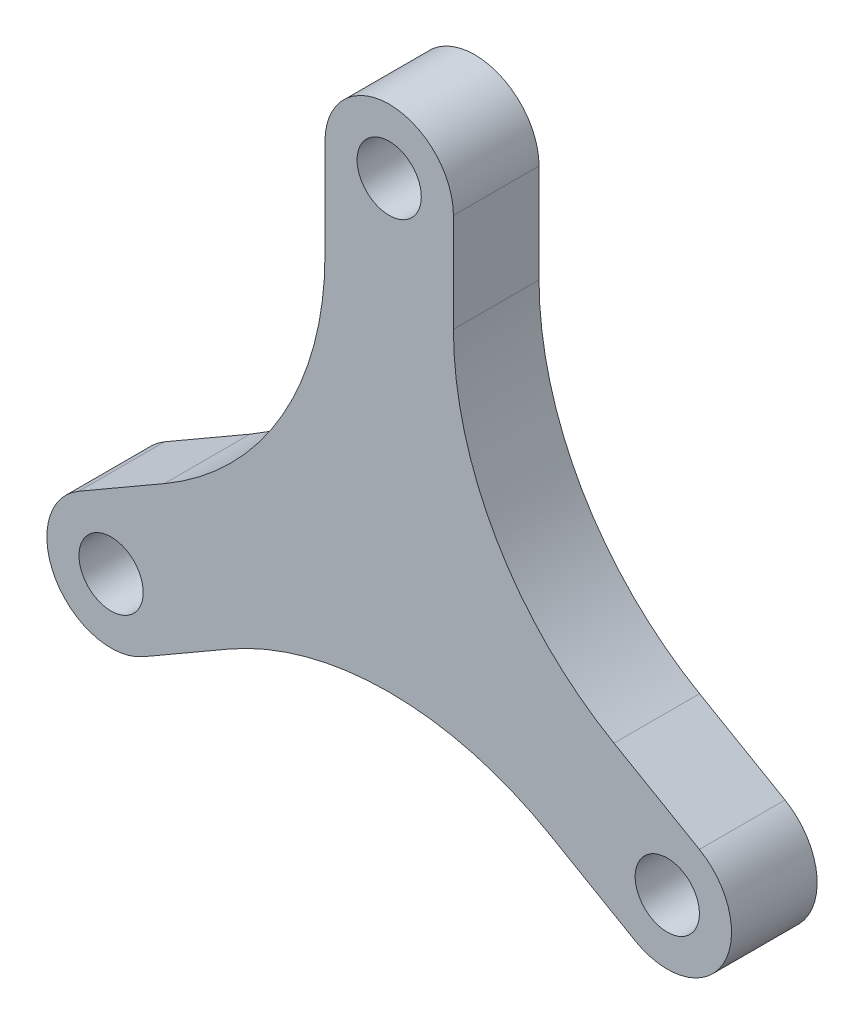
ISO-10303-21;
HEADER;
FILE_DESCRIPTION(('STEP AP214'),'2;1');
FILE_NAME('part.step','',(''),(''),'','','');
FILE_SCHEMA(('AUTOMOTIVE_DESIGN { 1 0 10303 214 1 1 1 1 }'));
ENDSEC;
DATA;
#1=APPLICATION_CONTEXT('core data for automotive mechanical design processes');
#2=APPLICATION_PROTOCOL_DEFINITION('international standard','automotive_design',2000,#1);
#3=PRODUCT_CONTEXT('',#1,'mechanical');
#4=PRODUCT('Part','Part','',(#3));
#5=PRODUCT_RELATED_PRODUCT_CATEGORY('part','',(#4));
#6=PRODUCT_DEFINITION_FORMATION('','',#4);
#7=PRODUCT_DEFINITION_CONTEXT('part definition',#1,'design');
#8=PRODUCT_DEFINITION('design','',#6,#7);
#9=PRODUCT_DEFINITION_SHAPE('','',#8);
#10=(LENGTH_UNIT() NAMED_UNIT(*) SI_UNIT(.MILLI.,.METRE.));
#11=(NAMED_UNIT(*) PLANE_ANGLE_UNIT() SI_UNIT($,.RADIAN.));
#12=(NAMED_UNIT(*) SI_UNIT($,.STERADIAN.) SOLID_ANGLE_UNIT());
#13=UNCERTAINTY_MEASURE_WITH_UNIT(LENGTH_MEASURE(1.E-05),#10,'distance_accuracy_value','');
#14=(GEOMETRIC_REPRESENTATION_CONTEXT(3) GLOBAL_UNCERTAINTY_ASSIGNED_CONTEXT((#13)) GLOBAL_UNIT_ASSIGNED_CONTEXT((#10,
#11,#12)) REPRESENTATION_CONTEXT('',''));
#15=CARTESIAN_POINT('',(0.,0.,0.));
#16=DIRECTION('',(0.,0.,1.));
#17=DIRECTION('',(1.,0.,0.));
#18=AXIS2_PLACEMENT_3D('',#15,#16,#17);
#19=CARTESIAN_POINT('',(0.,15.,4.));
#20=DIRECTION('',(0.,0.,1.));
#21=DIRECTION('',(1.,0.,0.));
#22=AXIS2_PLACEMENT_3D('',#19,#20,#21);
#23=PLANE('',#22);
#24=CARTESIAN_POINT('',(12.9903810567665,-7.49999999999926,4.));
#25=DIRECTION('',(0.,0.,1.));
#26=DIRECTION('',(1.,0.,0.));
#27=AXIS2_PLACEMENT_3D('',#24,#25,#26);
#28=CIRCLE('',#27,1.50000000000078);
#29=CARTESIAN_POINT('',(14.4903810567673,-7.49999999999926,4.));
#30=VERTEX_POINT('',#29);
#31=EDGE_CURVE('E360',#30,#30,#28,.T.);
#32=ORIENTED_EDGE('',*,*,#31,.F.);
#33=EDGE_LOOP('',(#32));
#34=FACE_BOUND('',#33,.T.);
#35=DIRECTION('',(0.,-1.,0.));
#36=VECTOR('',#35,1.);
#37=CARTESIAN_POINT('',(-3.,15.,4.));
#38=LINE('',#37,#36);
#39=CARTESIAN_POINT('',(-3.,15.,4.));
#40=VERTEX_POINT('',#39);
#41=CARTESIAN_POINT('',(-3.,10.3923048454133,4.));
#42=VERTEX_POINT('',#41);
#43=EDGE_CURVE('E379',#40,#42,#38,.T.);
#44=ORIENTED_EDGE('',*,*,#43,.T.);
#45=CARTESIAN_POINT('',(-18.,10.3923048454133,4.));
#46=DIRECTION('',(0.,0.,1.));
#47=DIRECTION('',(1.,0.,0.));
#48=AXIS2_PLACEMENT_3D('',#45,#46,#47);
#49=CIRCLE('',#48,15.);
#50=CARTESIAN_POINT('',(-10.5,-2.59807621135326,4.));
#51=VERTEX_POINT('',#50);
#52=EDGE_CURVE('E137',#42,#51,#49,.F.);
#53=ORIENTED_EDGE('',*,*,#52,.T.);
#54=DIRECTION('',(-0.866025403784438,-0.5,0.));
#55=VECTOR('',#54,1.);
#56=CARTESIAN_POINT('',(-14.490381056766,-4.90192378864628,4.));
#57=LINE('',#56,#55);
#58=CARTESIAN_POINT('',(-14.490381056766,-4.90192378864628,4.));
#59=VERTEX_POINT('',#58);
#60=EDGE_CURVE('E129',#51,#59,#57,.T.);
#61=ORIENTED_EDGE('',*,*,#60,.T.);
#62=CARTESIAN_POINT('',(-12.990381056766,-7.4999999999996,4.));
#63=DIRECTION('',(0.,0.,1.));
#64=DIRECTION('',(1.,0.,0.));
#65=AXIS2_PLACEMENT_3D('',#62,#63,#64);
#66=CIRCLE('',#65,3.);
#67=CARTESIAN_POINT('',(-11.490381056766,-10.0980762113529,4.));
#68=VERTEX_POINT('',#67);
#69=EDGE_CURVE('E134',#59,#68,#66,.T.);
#70=ORIENTED_EDGE('',*,*,#69,.T.);
#71=DIRECTION('',(0.866025403784438,0.5,0.));
#72=VECTOR('',#71,1.);
#73=CARTESIAN_POINT('',(-11.490381056766,-10.0980762113529,4.));
#74=LINE('',#73,#72);
#75=CARTESIAN_POINT('',(-7.49999999999943,-7.79422863405957,4.));
#76=VERTEX_POINT('',#75);
#77=EDGE_CURVE('E151',#68,#76,#74,.T.);
#78=ORIENTED_EDGE('',*,*,#77,.T.);
#79=CARTESIAN_POINT('',(5.79397640976254E-13,-20.7846096908261,4.));
#80=DIRECTION('',(0.,0.,1.));
#81=DIRECTION('',(1.,0.,0.));
#82=AXIS2_PLACEMENT_3D('',#79,#80,#81);
#83=CIRCLE('',#82,15.);
#84=CARTESIAN_POINT('',(7.50000000000058,-7.79422863405957,4.));
#85=VERTEX_POINT('',#84);
#86=EDGE_CURVE('E177',#76,#85,#83,.F.);
#87=ORIENTED_EDGE('',*,*,#86,.T.);
#88=DIRECTION('',(0.866025403784439,-0.5,0.));
#89=VECTOR('',#88,1.);
#90=CARTESIAN_POINT('',(11.4903810567665,-10.0980762113526,4.));
#91=LINE('',#90,#89);
#92=CARTESIAN_POINT('',(11.4903810567665,-10.0980762113526,4.));
#93=VERTEX_POINT('',#92);
#94=EDGE_CURVE('E369',#85,#93,#91,.T.);
#95=ORIENTED_EDGE('',*,*,#94,.T.);
#96=CARTESIAN_POINT('',(12.9903810567665,-7.49999999999926,4.));
#97=DIRECTION('',(0.,0.,1.));
#98=DIRECTION('',(1.,0.,0.));
#99=AXIS2_PLACEMENT_3D('',#96,#97,#98);
#100=CIRCLE('',#99,3.);
#101=CARTESIAN_POINT('',(14.4903810567665,-4.90192378864594,4.));
#102=VERTEX_POINT('',#101);
#103=EDGE_CURVE('E371',#93,#102,#100,.T.);
#104=ORIENTED_EDGE('',*,*,#103,.T.);
#105=DIRECTION('',(-0.866025403784439,0.5,0.));
#106=VECTOR('',#105,1.);
#107=CARTESIAN_POINT('',(14.4903810567665,-4.90192378864594,4.));
#108=LINE('',#107,#106);
#109=CARTESIAN_POINT('',(10.5,-2.5980762113526,4.));
#110=VERTEX_POINT('',#109);
#111=EDGE_CURVE('E373',#102,#110,#108,.T.);
#112=ORIENTED_EDGE('',*,*,#111,.T.);
#113=CARTESIAN_POINT('',(18.,10.392304845414,4.));
#114=DIRECTION('',(0.,0.,1.));
#115=DIRECTION('',(1.,0.,0.));
#116=AXIS2_PLACEMENT_3D('',#113,#114,#115);
#117=CIRCLE('',#116,15.);
#118=CARTESIAN_POINT('',(3.,10.392304845414,4.));
#119=VERTEX_POINT('',#118);
#120=EDGE_CURVE('E11',#110,#119,#117,.F.);
#121=ORIENTED_EDGE('',*,*,#120,.T.);
#122=DIRECTION('',(0.,1.,0.));
#123=VECTOR('',#122,1.);
#124=CARTESIAN_POINT('',(3.,15.,4.));
#125=LINE('',#124,#123);
#126=CARTESIAN_POINT('',(3.,15.,4.));
#127=VERTEX_POINT('',#126);
#128=EDGE_CURVE('E375',#119,#127,#125,.T.);
#129=ORIENTED_EDGE('',*,*,#128,.T.);
#130=CARTESIAN_POINT('',(0.,15.,4.));
#131=DIRECTION('',(0.,0.,1.));
#132=DIRECTION('',(1.,0.,0.));
#133=AXIS2_PLACEMENT_3D('',#130,#131,#132);
#134=CIRCLE('',#133,3.);
#135=EDGE_CURVE('E377',#127,#40,#134,.T.);
#136=ORIENTED_EDGE('',*,*,#135,.T.);
#137=EDGE_LOOP('',(#44,#53,#61,#70,#78,#87,#95,#104,#112,#121,#129,#136));
#138=FACE_BOUND('',#137,.T.);
#139=CARTESIAN_POINT('',(0.,15.,4.));
#140=DIRECTION('',(0.,0.,1.));
#141=DIRECTION('',(1.,0.,0.));
#142=AXIS2_PLACEMENT_3D('',#139,#140,#141);
#143=CIRCLE('',#142,1.5);
#144=CARTESIAN_POINT('',(1.5,15.,4.));
#145=VERTEX_POINT('',#144);
#146=EDGE_CURVE('E356',#145,#145,#143,.T.);
#147=ORIENTED_EDGE('',*,*,#146,.F.);
#148=EDGE_LOOP('',(#147));
#149=FACE_BOUND('',#148,.T.);
#150=CARTESIAN_POINT('',(-12.990381056766,-7.4999999999996,4.));
#151=DIRECTION('',(0.,0.,1.));
#152=DIRECTION('',(1.,0.,0.));
#153=AXIS2_PLACEMENT_3D('',#150,#151,#152);
#154=CIRCLE('',#153,1.50000000000031);
#155=CARTESIAN_POINT('',(-11.4903810567656,-7.4999999999996,4.));
#156=VERTEX_POINT('',#155);
#157=EDGE_CURVE('E419',#156,#156,#154,.T.);
#158=ORIENTED_EDGE('',*,*,#157,.F.);
#159=EDGE_LOOP('',(#158));
#160=FACE_BOUND('',#159,.T.);
#161=ADVANCED_FACE('F41',(#34,#138,#149,#160),#23,.T.);
#162=CARTESIAN_POINT('',(0.,15.,0.));
#163=DIRECTION('',(0.,0.,1.));
#164=DIRECTION('',(1.,0.,0.));
#165=AXIS2_PLACEMENT_3D('',#162,#163,#164);
#166=PLANE('',#165);
#167=DIRECTION('',(-0.866025403784438,-0.5,0.));
#168=VECTOR('',#167,1.);
#169=CARTESIAN_POINT('',(-14.490381056766,-4.90192378864628,0.));
#170=LINE('',#169,#168);
#171=CARTESIAN_POINT('',(-10.5,-2.59807621135326,0.));
#172=VERTEX_POINT('',#171);
#173=CARTESIAN_POINT('',(-14.490381056766,-4.90192378864628,0.));
#174=VERTEX_POINT('',#173);
#175=EDGE_CURVE('E155',#172,#174,#170,.T.);
#176=ORIENTED_EDGE('',*,*,#175,.F.);
#177=CARTESIAN_POINT('',(-18.,10.3923048454133,0.));
#178=DIRECTION('',(0.,0.,1.));
#179=DIRECTION('',(1.,0.,0.));
#180=AXIS2_PLACEMENT_3D('',#177,#178,#179);
#181=CIRCLE('',#180,15.);
#182=CARTESIAN_POINT('',(-3.,10.3923048454133,0.));
#183=VERTEX_POINT('',#182);
#184=EDGE_CURVE('E179',#172,#183,#181,.T.);
#185=ORIENTED_EDGE('',*,*,#184,.T.);
#186=DIRECTION('',(0.,-1.,0.));
#187=VECTOR('',#186,1.);
#188=CARTESIAN_POINT('',(-3.,15.,0.));
#189=LINE('',#188,#187);
#190=CARTESIAN_POINT('',(-3.,15.,0.));
#191=VERTEX_POINT('',#190);
#192=EDGE_CURVE('E142',#191,#183,#189,.T.);
#193=ORIENTED_EDGE('',*,*,#192,.F.);
#194=CARTESIAN_POINT('',(0.,15.,0.));
#195=DIRECTION('',(0.,0.,1.));
#196=DIRECTION('',(1.,0.,0.));
#197=AXIS2_PLACEMENT_3D('',#194,#195,#196);
#198=CIRCLE('',#197,3.);
#199=CARTESIAN_POINT('',(3.,15.,0.));
#200=VERTEX_POINT('',#199);
#201=EDGE_CURVE('E194',#200,#191,#198,.T.);
#202=ORIENTED_EDGE('',*,*,#201,.F.);
#203=DIRECTION('',(0.,1.,0.));
#204=VECTOR('',#203,1.);
#205=CARTESIAN_POINT('',(3.,15.,0.));
#206=LINE('',#205,#204);
#207=CARTESIAN_POINT('',(3.,10.392304845414,0.));
#208=VERTEX_POINT('',#207);
#209=EDGE_CURVE('E393',#208,#200,#206,.T.);
#210=ORIENTED_EDGE('',*,*,#209,.F.);
#211=CARTESIAN_POINT('',(18.,10.392304845414,0.));
#212=DIRECTION('',(0.,0.,1.));
#213=DIRECTION('',(1.,0.,0.));
#214=AXIS2_PLACEMENT_3D('',#211,#212,#213);
#215=CIRCLE('',#214,15.);
#216=CARTESIAN_POINT('',(10.5,-2.5980762113526,0.));
#217=VERTEX_POINT('',#216);
#218=EDGE_CURVE('E49',#208,#217,#215,.T.);
#219=ORIENTED_EDGE('',*,*,#218,.T.);
#220=DIRECTION('',(-0.866025403784439,0.5,0.));
#221=VECTOR('',#220,1.);
#222=CARTESIAN_POINT('',(14.4903810567665,-4.90192378864594,0.));
#223=LINE('',#222,#221);
#224=CARTESIAN_POINT('',(14.4903810567665,-4.90192378864594,0.));
#225=VERTEX_POINT('',#224);
#226=EDGE_CURVE('E391',#225,#217,#223,.T.);
#227=ORIENTED_EDGE('',*,*,#226,.F.);
#228=CARTESIAN_POINT('',(12.9903810567665,-7.49999999999926,0.));
#229=DIRECTION('',(0.,0.,1.));
#230=DIRECTION('',(1.,0.,0.));
#231=AXIS2_PLACEMENT_3D('',#228,#229,#230);
#232=CIRCLE('',#231,3.);
#233=CARTESIAN_POINT('',(11.4903810567665,-10.0980762113526,0.));
#234=VERTEX_POINT('',#233);
#235=EDGE_CURVE('E389',#234,#225,#232,.T.);
#236=ORIENTED_EDGE('',*,*,#235,.F.);
#237=DIRECTION('',(0.866025403784439,-0.5,0.));
#238=VECTOR('',#237,1.);
#239=CARTESIAN_POINT('',(11.4903810567665,-10.0980762113526,0.));
#240=LINE('',#239,#238);
#241=CARTESIAN_POINT('',(7.50000000000058,-7.79422863405957,0.));
#242=VERTEX_POINT('',#241);
#243=EDGE_CURVE('E387',#242,#234,#240,.T.);
#244=ORIENTED_EDGE('',*,*,#243,.F.);
#245=CARTESIAN_POINT('',(5.79397640976254E-13,-20.7846096908261,0.));
#246=DIRECTION('',(0.,0.,1.));
#247=DIRECTION('',(1.,0.,0.));
#248=AXIS2_PLACEMENT_3D('',#245,#246,#247);
#249=CIRCLE('',#248,15.);
#250=CARTESIAN_POINT('',(-7.49999999999943,-7.79422863405957,0.));
#251=VERTEX_POINT('',#250);
#252=EDGE_CURVE('E175',#242,#251,#249,.T.);
#253=ORIENTED_EDGE('',*,*,#252,.T.);
#254=DIRECTION('',(0.866025403784438,0.5,0.));
#255=VECTOR('',#254,1.);
#256=CARTESIAN_POINT('',(-11.490381056766,-10.0980762113529,0.));
#257=LINE('',#256,#255);
#258=CARTESIAN_POINT('',(-11.490381056766,-10.0980762113529,0.));
#259=VERTEX_POINT('',#258);
#260=EDGE_CURVE('E384',#259,#251,#257,.T.);
#261=ORIENTED_EDGE('',*,*,#260,.F.);
#262=CARTESIAN_POINT('',(-12.990381056766,-7.4999999999996,0.));
#263=DIRECTION('',(0.,0.,1.));
#264=DIRECTION('',(1.,0.,0.));
#265=AXIS2_PLACEMENT_3D('',#262,#263,#264);
#266=CIRCLE('',#265,3.);
#267=EDGE_CURVE('E382',#174,#259,#266,.T.);
#268=ORIENTED_EDGE('',*,*,#267,.F.);
#269=EDGE_LOOP('',(#176,#185,#193,#202,#210,#219,#227,#236,#244,#253,#261,#268));
#270=FACE_BOUND('',#269,.T.);
#271=CARTESIAN_POINT('',(0.,15.,0.));
#272=DIRECTION('',(0.,0.,1.));
#273=DIRECTION('',(1.,0.,0.));
#274=AXIS2_PLACEMENT_3D('',#271,#272,#273);
#275=CIRCLE('',#274,1.5);
#276=CARTESIAN_POINT('',(1.5,15.,0.));
#277=VERTEX_POINT('',#276);
#278=EDGE_CURVE('E359',#277,#277,#275,.T.);
#279=ORIENTED_EDGE('',*,*,#278,.T.);
#280=EDGE_LOOP('',(#279));
#281=FACE_BOUND('',#280,.T.);
#282=CARTESIAN_POINT('',(12.9903810567665,-7.49999999999926,0.));
#283=DIRECTION('',(0.,0.,1.));
#284=DIRECTION('',(1.,0.,0.));
#285=AXIS2_PLACEMENT_3D('',#282,#283,#284);
#286=CIRCLE('',#285,1.50000000000078);
#287=CARTESIAN_POINT('',(14.4903810567673,-7.49999999999926,0.));
#288=VERTEX_POINT('',#287);
#289=EDGE_CURVE('E364',#288,#288,#286,.T.);
#290=ORIENTED_EDGE('',*,*,#289,.T.);
#291=EDGE_LOOP('',(#290));
#292=FACE_BOUND('',#291,.T.);
#293=CARTESIAN_POINT('',(-12.990381056766,-7.4999999999996,0.));
#294=DIRECTION('',(0.,0.,1.));
#295=DIRECTION('',(1.,0.,0.));
#296=AXIS2_PLACEMENT_3D('',#293,#294,#295);
#297=CIRCLE('',#296,1.50000000000031);
#298=CARTESIAN_POINT('',(-11.4903810567656,-7.4999999999996,0.));
#299=VERTEX_POINT('',#298);
#300=EDGE_CURVE('E421',#299,#299,#297,.T.);
#301=ORIENTED_EDGE('',*,*,#300,.T.);
#302=EDGE_LOOP('',(#301));
#303=FACE_BOUND('',#302,.T.);
#304=ADVANCED_FACE('F183',(#270,#281,#292,#303),#166,.F.);
#305=CARTESIAN_POINT('',(-14.490381056766,-4.90192378864628,4.));
#306=DIRECTION('',(0.5,-0.866025403784438,0.));
#307=DIRECTION('',(0.866025403784438,0.5,0.));
#308=AXIS2_PLACEMENT_3D('',#305,#306,#307);
#309=PLANE('',#308);
#310=ORIENTED_EDGE('',*,*,#60,.F.);
#311=DIRECTION('',(0.,0.,-1.));
#312=VECTOR('',#311,1.);
#313=CARTESIAN_POINT('',(-10.5,-2.59807621135326,0.));
#314=LINE('',#313,#312);
#315=EDGE_CURVE('E167',#51,#172,#314,.T.);
#316=ORIENTED_EDGE('',*,*,#315,.T.);
#317=ORIENTED_EDGE('',*,*,#175,.T.);
#318=DIRECTION('',(0.,0.,-1.));
#319=VECTOR('',#318,1.);
#320=CARTESIAN_POINT('',(-14.490381056766,-4.90192378864628,4.));
#321=LINE('',#320,#319);
#322=EDGE_CURVE('E147',#59,#174,#321,.T.);
#323=ORIENTED_EDGE('',*,*,#322,.F.);
#324=EDGE_LOOP('',(#310,#316,#317,#323));
#325=FACE_BOUND('',#324,.T.);
#326=ADVANCED_FACE('F153',(#325),#309,.F.);
#327=CARTESIAN_POINT('',(-12.990381056766,-7.4999999999996,4.));
#328=DIRECTION('',(0.,0.,-1.));
#329=DIRECTION('',(-1.,0.,0.));
#330=AXIS2_PLACEMENT_3D('',#327,#328,#329);
#331=CYLINDRICAL_SURFACE('',#330,3.);
#332=ORIENTED_EDGE('',*,*,#267,.T.);
#333=DIRECTION('',(0.,0.,-1.));
#334=VECTOR('',#333,1.);
#335=CARTESIAN_POINT('',(-11.490381056766,-10.0980762113529,4.));
#336=LINE('',#335,#334);
#337=EDGE_CURVE('E149',#68,#259,#336,.T.);
#338=ORIENTED_EDGE('',*,*,#337,.F.);
#339=ORIENTED_EDGE('',*,*,#69,.F.);
#340=ORIENTED_EDGE('',*,*,#322,.T.);
#341=EDGE_LOOP('',(#332,#338,#339,#340));
#342=FACE_BOUND('',#341,.T.);
#343=ADVANCED_FACE('F146',(#342),#331,.T.);
#344=CARTESIAN_POINT('',(-11.490381056766,-10.0980762113529,4.));
#345=DIRECTION('',(-0.5,0.866025403784438,0.));
#346=DIRECTION('',(-0.866025403784438,-0.5,0.));
#347=AXIS2_PLACEMENT_3D('',#344,#345,#346);
#348=PLANE('',#347);
#349=ORIENTED_EDGE('',*,*,#260,.T.);
#350=DIRECTION('',(0.,0.,-1.));
#351=VECTOR('',#350,1.);
#352=CARTESIAN_POINT('',(-7.49999999999943,-7.79422863405957,4.));
#353=LINE('',#352,#351);
#354=EDGE_CURVE('E160',#251,#76,#353,.F.);
#355=ORIENTED_EDGE('',*,*,#354,.T.);
#356=ORIENTED_EDGE('',*,*,#77,.F.);
#357=ORIENTED_EDGE('',*,*,#337,.T.);
#358=EDGE_LOOP('',(#349,#355,#356,#357));
#359=FACE_BOUND('',#358,.T.);
#360=ADVANCED_FACE('F240',(#359),#348,.F.);
#361=CARTESIAN_POINT('',(11.4903810567665,-10.0980762113526,4.));
#362=DIRECTION('',(0.5,0.866025403784439,0.));
#363=DIRECTION('',(-0.866025403784439,0.5,0.));
#364=AXIS2_PLACEMENT_3D('',#361,#362,#363);
#365=PLANE('',#364);
#366=ORIENTED_EDGE('',*,*,#94,.F.);
#367=DIRECTION('',(0.,0.,-1.));
#368=VECTOR('',#367,1.);
#369=CARTESIAN_POINT('',(7.50000000000058,-7.79422863405957,0.));
#370=LINE('',#369,#368);
#371=EDGE_CURVE('E157',#85,#242,#370,.T.);
#372=ORIENTED_EDGE('',*,*,#371,.T.);
#373=ORIENTED_EDGE('',*,*,#243,.T.);
#374=DIRECTION('',(0.,0.,-1.));
#375=VECTOR('',#374,1.);
#376=CARTESIAN_POINT('',(11.4903810567665,-10.0980762113526,4.));
#377=LINE('',#376,#375);
#378=EDGE_CURVE('E162',#93,#234,#377,.T.);
#379=ORIENTED_EDGE('',*,*,#378,.F.);
#380=EDGE_LOOP('',(#366,#372,#373,#379));
#381=FACE_BOUND('',#380,.T.);
#382=ADVANCED_FACE('F236',(#381),#365,.F.);
#383=CARTESIAN_POINT('',(12.9903810567665,-7.49999999999926,4.));
#384=DIRECTION('',(0.,0.,-1.));
#385=DIRECTION('',(-1.,0.,0.));
#386=AXIS2_PLACEMENT_3D('',#383,#384,#385);
#387=CYLINDRICAL_SURFACE('',#386,3.);
#388=ORIENTED_EDGE('',*,*,#235,.T.);
#389=DIRECTION('',(0.,0.,-1.));
#390=VECTOR('',#389,1.);
#391=CARTESIAN_POINT('',(14.4903810567665,-4.90192378864594,4.));
#392=LINE('',#391,#390);
#393=EDGE_CURVE('E400',#102,#225,#392,.T.);
#394=ORIENTED_EDGE('',*,*,#393,.F.);
#395=ORIENTED_EDGE('',*,*,#103,.F.);
#396=ORIENTED_EDGE('',*,*,#378,.T.);
#397=EDGE_LOOP('',(#388,#394,#395,#396));
#398=FACE_BOUND('',#397,.T.);
#399=ADVANCED_FACE('F233',(#398),#387,.T.);
#400=CARTESIAN_POINT('',(14.4903810567665,-4.90192378864594,4.));
#401=DIRECTION('',(-0.5,-0.866025403784439,0.));
#402=DIRECTION('',(0.866025403784439,-0.5,0.));
#403=AXIS2_PLACEMENT_3D('',#400,#401,#402);
#404=PLANE('',#403);
#405=ORIENTED_EDGE('',*,*,#226,.T.);
#406=DIRECTION('',(0.,0.,-1.));
#407=VECTOR('',#406,1.);
#408=CARTESIAN_POINT('',(10.5,-2.5980762113526,4.));
#409=LINE('',#408,#407);
#410=EDGE_CURVE('E56',#217,#110,#409,.F.);
#411=ORIENTED_EDGE('',*,*,#410,.T.);
#412=ORIENTED_EDGE('',*,*,#111,.F.);
#413=ORIENTED_EDGE('',*,*,#393,.T.);
#414=EDGE_LOOP('',(#405,#411,#412,#413));
#415=FACE_BOUND('',#414,.T.);
#416=ADVANCED_FACE('F229',(#415),#404,.F.);
#417=CARTESIAN_POINT('',(3.,15.,4.));
#418=DIRECTION('',(-1.,0.,0.));
#419=DIRECTION('',(0.,-1.,0.));
#420=AXIS2_PLACEMENT_3D('',#417,#418,#419);
#421=PLANE('',#420);
#422=ORIENTED_EDGE('',*,*,#128,.F.);
#423=DIRECTION('',(0.,0.,-1.));
#424=VECTOR('',#423,1.);
#425=CARTESIAN_POINT('',(3.,10.392304845414,0.));
#426=LINE('',#425,#424);
#427=EDGE_CURVE('E171',#119,#208,#426,.T.);
#428=ORIENTED_EDGE('',*,*,#427,.T.);
#429=ORIENTED_EDGE('',*,*,#209,.T.);
#430=DIRECTION('',(0.,0.,-1.));
#431=VECTOR('',#430,1.);
#432=CARTESIAN_POINT('',(3.,15.,4.));
#433=LINE('',#432,#431);
#434=EDGE_CURVE('E397',#127,#200,#433,.T.);
#435=ORIENTED_EDGE('',*,*,#434,.F.);
#436=EDGE_LOOP('',(#422,#428,#429,#435));
#437=FACE_BOUND('',#436,.T.);
#438=ADVANCED_FACE('F225',(#437),#421,.F.);
#439=CARTESIAN_POINT('',(0.,15.,4.));
#440=DIRECTION('',(0.,0.,-1.));
#441=DIRECTION('',(-1.,0.,0.));
#442=AXIS2_PLACEMENT_3D('',#439,#440,#441);
#443=CYLINDRICAL_SURFACE('',#442,3.);
#444=ORIENTED_EDGE('',*,*,#201,.T.);
#445=DIRECTION('',(0.,0.,-1.));
#446=VECTOR('',#445,1.);
#447=CARTESIAN_POINT('',(-3.,15.,4.));
#448=LINE('',#447,#446);
#449=EDGE_CURVE('E193',#40,#191,#448,.T.);
#450=ORIENTED_EDGE('',*,*,#449,.F.);
#451=ORIENTED_EDGE('',*,*,#135,.F.);
#452=ORIENTED_EDGE('',*,*,#434,.T.);
#453=EDGE_LOOP('',(#444,#450,#451,#452));
#454=FACE_BOUND('',#453,.T.);
#455=ADVANCED_FACE('F222',(#454),#443,.T.);
#456=CARTESIAN_POINT('',(-3.,15.,4.));
#457=DIRECTION('',(1.,0.,0.));
#458=DIRECTION('',(0.,1.,0.));
#459=AXIS2_PLACEMENT_3D('',#456,#457,#458);
#460=PLANE('',#459);
#461=ORIENTED_EDGE('',*,*,#192,.T.);
#462=DIRECTION('',(0.,0.,-1.));
#463=VECTOR('',#462,1.);
#464=CARTESIAN_POINT('',(-3.,10.3923048454133,4.));
#465=LINE('',#464,#463);
#466=EDGE_CURVE('E169',#183,#42,#465,.F.);
#467=ORIENTED_EDGE('',*,*,#466,.T.);
#468=ORIENTED_EDGE('',*,*,#43,.F.);
#469=ORIENTED_EDGE('',*,*,#449,.T.);
#470=EDGE_LOOP('',(#461,#467,#468,#469));
#471=FACE_BOUND('',#470,.T.);
#472=ADVANCED_FACE('F190',(#471),#460,.F.);
#473=CARTESIAN_POINT('',(0.,15.,4.));
#474=DIRECTION('',(0.,0.,-1.));
#475=DIRECTION('',(-1.,0.,0.));
#476=AXIS2_PLACEMENT_3D('',#473,#474,#475);
#477=CYLINDRICAL_SURFACE('',#476,1.5);
#478=ORIENTED_EDGE('',*,*,#146,.T.);
#479=EDGE_LOOP('',(#478));
#480=FACE_BOUND('',#479,.T.);
#481=ORIENTED_EDGE('',*,*,#278,.F.);
#482=EDGE_LOOP('',(#481));
#483=FACE_BOUND('',#482,.T.);
#484=ADVANCED_FACE('F217',(#480,#483),#477,.F.);
#485=CARTESIAN_POINT('',(12.9903810567665,-7.49999999999926,4.));
#486=DIRECTION('',(0.,0.,-1.));
#487=DIRECTION('',(-1.,0.,0.));
#488=AXIS2_PLACEMENT_3D('',#485,#486,#487);
#489=CYLINDRICAL_SURFACE('',#488,1.50000000000078);
#490=ORIENTED_EDGE('',*,*,#31,.T.);
#491=EDGE_LOOP('',(#490));
#492=FACE_BOUND('',#491,.T.);
#493=ORIENTED_EDGE('',*,*,#289,.F.);
#494=EDGE_LOOP('',(#493));
#495=FACE_BOUND('',#494,.T.);
#496=ADVANCED_FACE('F305',(#492,#495),#489,.F.);
#497=CARTESIAN_POINT('',(-12.990381056766,-7.4999999999996,4.));
#498=DIRECTION('',(0.,0.,-1.));
#499=DIRECTION('',(-1.,0.,0.));
#500=AXIS2_PLACEMENT_3D('',#497,#498,#499);
#501=CYLINDRICAL_SURFACE('',#500,1.50000000000031);
#502=ORIENTED_EDGE('',*,*,#157,.T.);
#503=EDGE_LOOP('',(#502));
#504=FACE_BOUND('',#503,.T.);
#505=ORIENTED_EDGE('',*,*,#300,.F.);
#506=EDGE_LOOP('',(#505));
#507=FACE_BOUND('',#506,.T.);
#508=ADVANCED_FACE('F204',(#504,#507),#501,.F.);
#509=CARTESIAN_POINT('',(5.79397640976254E-13,-20.7846096908261,4.));
#510=DIRECTION('',(0.,0.,1.));
#511=DIRECTION('',(1.,0.,0.));
#512=AXIS2_PLACEMENT_3D('',#509,#510,#511);
#513=CYLINDRICAL_SURFACE('',#512,15.);
#514=ORIENTED_EDGE('',*,*,#86,.F.);
#515=ORIENTED_EDGE('',*,*,#354,.F.);
#516=ORIENTED_EDGE('',*,*,#252,.F.);
#517=ORIENTED_EDGE('',*,*,#371,.F.);
#518=EDGE_LOOP('',(#514,#515,#516,#517));
#519=FACE_BOUND('',#518,.T.);
#520=ADVANCED_FACE('F198',(#519),#513,.F.);
#521=CARTESIAN_POINT('',(-18.,10.3923048454133,4.));
#522=DIRECTION('',(0.,0.,1.));
#523=DIRECTION('',(1.,0.,0.));
#524=AXIS2_PLACEMENT_3D('',#521,#522,#523);
#525=CYLINDRICAL_SURFACE('',#524,15.);
#526=ORIENTED_EDGE('',*,*,#52,.F.);
#527=ORIENTED_EDGE('',*,*,#466,.F.);
#528=ORIENTED_EDGE('',*,*,#184,.F.);
#529=ORIENTED_EDGE('',*,*,#315,.F.);
#530=EDGE_LOOP('',(#526,#527,#528,#529));
#531=FACE_BOUND('',#530,.T.);
#532=ADVANCED_FACE('F196',(#531),#525,.F.);
#533=CARTESIAN_POINT('',(18.,10.392304845414,4.));
#534=DIRECTION('',(0.,0.,1.));
#535=DIRECTION('',(1.,0.,0.));
#536=AXIS2_PLACEMENT_3D('',#533,#534,#535);
#537=CYLINDRICAL_SURFACE('',#536,15.);
#538=ORIENTED_EDGE('',*,*,#120,.F.);
#539=ORIENTED_EDGE('',*,*,#410,.F.);
#540=ORIENTED_EDGE('',*,*,#218,.F.);
#541=ORIENTED_EDGE('',*,*,#427,.F.);
#542=EDGE_LOOP('',(#538,#539,#540,#541));
#543=FACE_BOUND('',#542,.T.);
#544=ADVANCED_FACE('F43',(#543),#537,.F.);
#545=CLOSED_SHELL('',(#161,#304,#326,#343,#360,#382,#399,#416,#438,#455,#472,#484,#496,#508,
#520,#532,#544));
#546=MANIFOLD_SOLID_BREP('B2',#545);
#547=ADVANCED_BREP_SHAPE_REPRESENTATION('',(#18,#546),#14);
#548=SHAPE_DEFINITION_REPRESENTATION(#9,#547);
ENDSEC;
END-ISO-10303-21;
